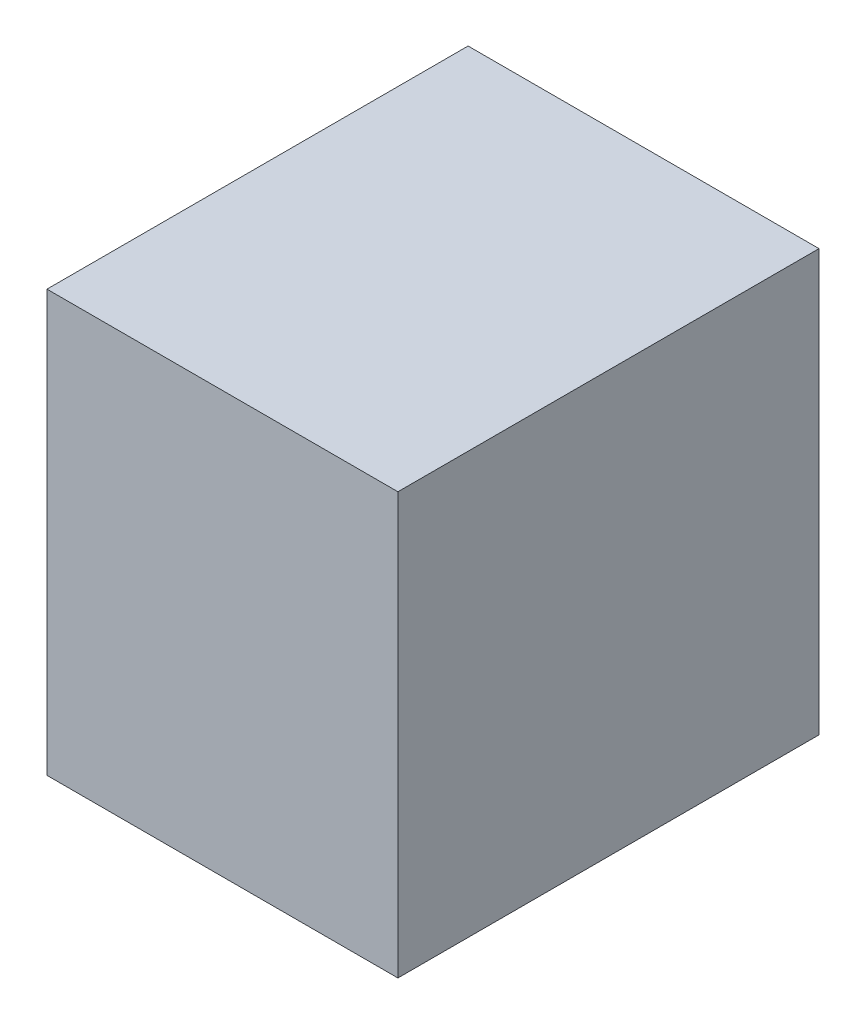
ISO-10303-21;
HEADER;
FILE_DESCRIPTION(('STEP AP214'),'2;1');
FILE_NAME('part.step','',(''),(''),'','','');
FILE_SCHEMA(('AUTOMOTIVE_DESIGN { 1 0 10303 214 1 1 1 1 }'));
ENDSEC;
DATA;
#1=APPLICATION_CONTEXT('core data for automotive mechanical design processes');
#2=APPLICATION_PROTOCOL_DEFINITION('international standard','automotive_design',2000,#1);
#3=PRODUCT_CONTEXT('',#1,'mechanical');
#4=PRODUCT('Part','Part','',(#3));
#5=PRODUCT_RELATED_PRODUCT_CATEGORY('part','',(#4));
#6=PRODUCT_DEFINITION_FORMATION('','',#4);
#7=PRODUCT_DEFINITION_CONTEXT('part definition',#1,'design');
#8=PRODUCT_DEFINITION('design','',#6,#7);
#9=PRODUCT_DEFINITION_SHAPE('','',#8);
#10=(LENGTH_UNIT() NAMED_UNIT(*) SI_UNIT(.MILLI.,.METRE.));
#11=(NAMED_UNIT(*) PLANE_ANGLE_UNIT() SI_UNIT($,.RADIAN.));
#12=(NAMED_UNIT(*) SI_UNIT($,.STERADIAN.) SOLID_ANGLE_UNIT());
#13=UNCERTAINTY_MEASURE_WITH_UNIT(LENGTH_MEASURE(1.E-05),#10,'distance_accuracy_value','');
#14=(GEOMETRIC_REPRESENTATION_CONTEXT(3) GLOBAL_UNCERTAINTY_ASSIGNED_CONTEXT((#13)) GLOBAL_UNIT_ASSIGNED_CONTEXT((#10,
#11,#12)) REPRESENTATION_CONTEXT('',''));
#15=CARTESIAN_POINT('',(0.,0.,0.));
#16=DIRECTION('',(0.,0.,1.));
#17=DIRECTION('',(1.,0.,0.));
#18=AXIS2_PLACEMENT_3D('',#15,#16,#17);
#19=CARTESIAN_POINT('',(525.,640.,-230.));
#20=DIRECTION('',(-1.,0.,0.));
#21=DIRECTION('',(0.,0.,1.));
#22=AXIS2_PLACEMENT_3D('',#19,#20,#21);
#23=PLANE('',#22);
#24=DIRECTION('',(0.,-1.,0.));
#25=VECTOR('',#24,1.);
#26=CARTESIAN_POINT('',(525.,640.,-170.));
#27=LINE('',#26,#25);
#28=CARTESIAN_POINT('',(525.,700.,-170.));
#29=VERTEX_POINT('',#28);
#30=CARTESIAN_POINT('',(525.,640.,-170.));
#31=VERTEX_POINT('',#30);
#32=EDGE_CURVE('E103',#29,#31,#27,.T.);
#33=ORIENTED_EDGE('',*,*,#32,.F.);
#34=DIRECTION('',(0.,0.,1.));
#35=VECTOR('',#34,1.);
#36=CARTESIAN_POINT('',(525.,700.,-230.));
#37=LINE('',#36,#35);
#38=CARTESIAN_POINT('',(525.,700.,-230.));
#39=VERTEX_POINT('',#38);
#40=EDGE_CURVE('E11',#39,#29,#37,.T.);
#41=ORIENTED_EDGE('',*,*,#40,.F.);
#42=DIRECTION('',(0.,-1.,0.));
#43=VECTOR('',#42,1.);
#44=CARTESIAN_POINT('',(525.,640.,-230.));
#45=LINE('',#44,#43);
#46=CARTESIAN_POINT('',(525.,640.,-230.));
#47=VERTEX_POINT('',#46);
#48=EDGE_CURVE('E97',#39,#47,#45,.T.);
#49=ORIENTED_EDGE('',*,*,#48,.T.);
#50=DIRECTION('',(0.,0.,1.));
#51=VECTOR('',#50,1.);
#52=CARTESIAN_POINT('',(525.,640.,-230.));
#53=LINE('',#52,#51);
#54=EDGE_CURVE('E42',#47,#31,#53,.T.);
#55=ORIENTED_EDGE('',*,*,#54,.T.);
#56=EDGE_LOOP('',(#33,#41,#49,#55));
#57=FACE_BOUND('',#56,.T.);
#58=ADVANCED_FACE('F39',(#57),#23,.T.);
#59=CARTESIAN_POINT('',(525.,700.,-230.));
#60=DIRECTION('',(0.,1.,0.));
#61=DIRECTION('',(0.,0.,1.));
#62=AXIS2_PLACEMENT_3D('',#59,#60,#61);
#63=PLANE('',#62);
#64=DIRECTION('',(-1.,0.,0.));
#65=VECTOR('',#64,1.);
#66=CARTESIAN_POINT('',(525.,700.,-170.));
#67=LINE('',#66,#65);
#68=CARTESIAN_POINT('',(575.,700.,-170.));
#69=VERTEX_POINT('',#68);
#70=EDGE_CURVE('E99',#69,#29,#67,.T.);
#71=ORIENTED_EDGE('',*,*,#70,.F.);
#72=DIRECTION('',(0.,0.,1.));
#73=VECTOR('',#72,1.);
#74=CARTESIAN_POINT('',(575.,700.,-230.));
#75=LINE('',#74,#73);
#76=CARTESIAN_POINT('',(575.,700.,-230.));
#77=VERTEX_POINT('',#76);
#78=EDGE_CURVE('E48',#77,#69,#75,.T.);
#79=ORIENTED_EDGE('',*,*,#78,.F.);
#80=DIRECTION('',(-1.,0.,0.));
#81=VECTOR('',#80,1.);
#82=CARTESIAN_POINT('',(525.,700.,-230.));
#83=LINE('',#82,#81);
#84=EDGE_CURVE('E94',#77,#39,#83,.T.);
#85=ORIENTED_EDGE('',*,*,#84,.T.);
#86=ORIENTED_EDGE('',*,*,#40,.T.);
#87=EDGE_LOOP('',(#71,#79,#85,#86));
#88=FACE_BOUND('',#87,.T.);
#89=ADVANCED_FACE('F113',(#88),#63,.T.);
#90=CARTESIAN_POINT('',(575.,640.,-230.));
#91=DIRECTION('',(1.,0.,0.));
#92=DIRECTION('',(0.,0.,-1.));
#93=AXIS2_PLACEMENT_3D('',#90,#91,#92);
#94=PLANE('',#93);
#95=DIRECTION('',(0.,1.,0.));
#96=VECTOR('',#95,1.);
#97=CARTESIAN_POINT('',(575.,640.,-170.));
#98=LINE('',#97,#96);
#99=CARTESIAN_POINT('',(575.,640.,-170.));
#100=VERTEX_POINT('',#99);
#101=EDGE_CURVE('E89',#100,#69,#98,.T.);
#102=ORIENTED_EDGE('',*,*,#101,.F.);
#103=DIRECTION('',(0.,0.,1.));
#104=VECTOR('',#103,1.);
#105=CARTESIAN_POINT('',(575.,640.,-230.));
#106=LINE('',#105,#104);
#107=CARTESIAN_POINT('',(575.,640.,-230.));
#108=VERTEX_POINT('',#107);
#109=EDGE_CURVE('E84',#108,#100,#106,.T.);
#110=ORIENTED_EDGE('',*,*,#109,.F.);
#111=DIRECTION('',(0.,1.,0.));
#112=VECTOR('',#111,1.);
#113=CARTESIAN_POINT('',(575.,640.,-230.));
#114=LINE('',#113,#112);
#115=EDGE_CURVE('E87',#108,#77,#114,.T.);
#116=ORIENTED_EDGE('',*,*,#115,.T.);
#117=ORIENTED_EDGE('',*,*,#78,.T.);
#118=EDGE_LOOP('',(#102,#110,#116,#117));
#119=FACE_BOUND('',#118,.T.);
#120=ADVANCED_FACE('F86',(#119),#94,.T.);
#121=CARTESIAN_POINT('',(525.,640.,-230.));
#122=DIRECTION('',(0.,-1.,0.));
#123=DIRECTION('',(0.,0.,-1.));
#124=AXIS2_PLACEMENT_3D('',#121,#122,#123);
#125=PLANE('',#124);
#126=DIRECTION('',(1.,0.,0.));
#127=VECTOR('',#126,1.);
#128=CARTESIAN_POINT('',(525.,640.,-170.));
#129=LINE('',#128,#127);
#130=EDGE_CURVE('E106',#31,#100,#129,.T.);
#131=ORIENTED_EDGE('',*,*,#130,.F.);
#132=ORIENTED_EDGE('',*,*,#54,.F.);
#133=DIRECTION('',(1.,0.,0.));
#134=VECTOR('',#133,1.);
#135=CARTESIAN_POINT('',(525.,640.,-230.));
#136=LINE('',#135,#134);
#137=EDGE_CURVE('E93',#47,#108,#136,.T.);
#138=ORIENTED_EDGE('',*,*,#137,.T.);
#139=ORIENTED_EDGE('',*,*,#109,.T.);
#140=EDGE_LOOP('',(#131,#132,#138,#139));
#141=FACE_BOUND('',#140,.T.);
#142=ADVANCED_FACE('F96',(#141),#125,.T.);
#143=CARTESIAN_POINT('',(0.,0.,-230.));
#144=DIRECTION('',(0.,0.,-1.));
#145=DIRECTION('',(-1.,0.,0.));
#146=AXIS2_PLACEMENT_3D('',#143,#144,#145);
#147=PLANE('',#146);
#148=ORIENTED_EDGE('',*,*,#48,.F.);
#149=ORIENTED_EDGE('',*,*,#84,.F.);
#150=ORIENTED_EDGE('',*,*,#115,.F.);
#151=ORIENTED_EDGE('',*,*,#137,.F.);
#152=EDGE_LOOP('',(#148,#149,#150,#151));
#153=FACE_BOUND('',#152,.T.);
#154=ADVANCED_FACE('F92',(#153),#147,.T.);
#155=CARTESIAN_POINT('',(0.,0.,-170.));
#156=DIRECTION('',(0.,0.,-1.));
#157=DIRECTION('',(-1.,0.,0.));
#158=AXIS2_PLACEMENT_3D('',#155,#156,#157);
#159=PLANE('',#158);
#160=ORIENTED_EDGE('',*,*,#32,.T.);
#161=ORIENTED_EDGE('',*,*,#130,.T.);
#162=ORIENTED_EDGE('',*,*,#101,.T.);
#163=ORIENTED_EDGE('',*,*,#70,.T.);
#164=EDGE_LOOP('',(#160,#161,#162,#163));
#165=FACE_BOUND('',#164,.T.);
#166=ADVANCED_FACE('F112',(#165),#159,.F.);
#167=CLOSED_SHELL('',(#58,#89,#120,#142,#154,#166));
#168=MANIFOLD_SOLID_BREP('B2',#167);
#169=ADVANCED_BREP_SHAPE_REPRESENTATION('',(#18,#168),#14);
#170=SHAPE_DEFINITION_REPRESENTATION(#9,#169);
ENDSEC;
END-ISO-10303-21;
